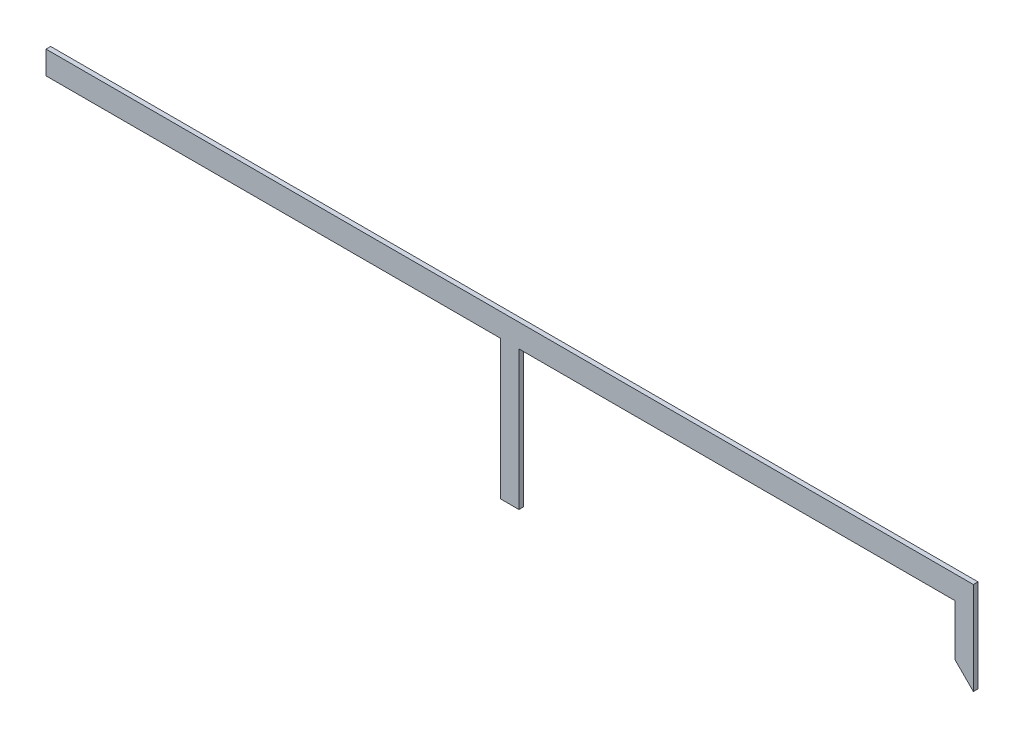
ISO-10303-21;
HEADER;
FILE_DESCRIPTION(('STEP AP214'),'2;1');
FILE_NAME('part.step','',(''),(''),'','','');
FILE_SCHEMA(('AUTOMOTIVE_DESIGN { 1 0 10303 214 1 1 1 1 }'));
ENDSEC;
DATA;
#1=APPLICATION_CONTEXT('core data for automotive mechanical design processes');
#2=APPLICATION_PROTOCOL_DEFINITION('international standard','automotive_design',2000,#1);
#3=PRODUCT_CONTEXT('',#1,'mechanical');
#4=PRODUCT('Part','Part','',(#3));
#5=PRODUCT_RELATED_PRODUCT_CATEGORY('part','',(#4));
#6=PRODUCT_DEFINITION_FORMATION('','',#4);
#7=PRODUCT_DEFINITION_CONTEXT('part definition',#1,'design');
#8=PRODUCT_DEFINITION('design','',#6,#7);
#9=PRODUCT_DEFINITION_SHAPE('','',#8);
#10=(LENGTH_UNIT() NAMED_UNIT(*) SI_UNIT(.MILLI.,.METRE.));
#11=(NAMED_UNIT(*) PLANE_ANGLE_UNIT() SI_UNIT($,.RADIAN.));
#12=(NAMED_UNIT(*) SI_UNIT($,.STERADIAN.) SOLID_ANGLE_UNIT());
#13=UNCERTAINTY_MEASURE_WITH_UNIT(LENGTH_MEASURE(1.E-05),#10,'distance_accuracy_value','');
#14=(GEOMETRIC_REPRESENTATION_CONTEXT(3) GLOBAL_UNCERTAINTY_ASSIGNED_CONTEXT((#13)) GLOBAL_UNIT_ASSIGNED_CONTEXT((#10,
#11,#12)) REPRESENTATION_CONTEXT('',''));
#15=CARTESIAN_POINT('',(0.,0.,0.));
#16=DIRECTION('',(0.,0.,1.));
#17=DIRECTION('',(1.,0.,0.));
#18=AXIS2_PLACEMENT_3D('',#15,#16,#17);
#19=CARTESIAN_POINT('',(500.,1.22464679914735E-13,5.));
#20=DIRECTION('',(-1.,0.,0.));
#21=DIRECTION('',(0.,0.,1.));
#22=AXIS2_PLACEMENT_3D('',#19,#20,#21);
#23=PLANE('',#22);
#24=DIRECTION('',(0.,1.,0.));
#25=VECTOR('',#24,1.);
#26=CARTESIAN_POINT('',(500.,1.22464679914735E-13,0.));
#27=LINE('',#26,#25);
#28=CARTESIAN_POINT('',(500.,-99.9999999999999,0.));
#29=VERTEX_POINT('',#28);
#30=CARTESIAN_POINT('',(500.,1.22464679914735E-13,0.));
#31=VERTEX_POINT('',#30);
#32=EDGE_CURVE('E142',#29,#31,#27,.T.);
#33=ORIENTED_EDGE('',*,*,#32,.T.);
#34=DIRECTION('',(0.,0.,-1.));
#35=VECTOR('',#34,1.);
#36=CARTESIAN_POINT('',(500.,1.22464679914735E-13,5.));
#37=LINE('',#36,#35);
#38=CARTESIAN_POINT('',(500.,1.22464679914735E-13,5.));
#39=VERTEX_POINT('',#38);
#40=EDGE_CURVE('E11',#39,#31,#37,.T.);
#41=ORIENTED_EDGE('',*,*,#40,.F.);
#42=DIRECTION('',(0.,1.,0.));
#43=VECTOR('',#42,1.);
#44=CARTESIAN_POINT('',(500.,1.22464679914735E-13,5.));
#45=LINE('',#44,#43);
#46=CARTESIAN_POINT('',(500.,-99.9999999999999,5.));
#47=VERTEX_POINT('',#46);
#48=EDGE_CURVE('E160',#47,#39,#45,.T.);
#49=ORIENTED_EDGE('',*,*,#48,.F.);
#50=DIRECTION('',(0.,0.,-1.));
#51=VECTOR('',#50,1.);
#52=CARTESIAN_POINT('',(500.,-99.9999999999999,5.));
#53=LINE('',#52,#51);
#54=EDGE_CURVE('E138',#47,#29,#53,.T.);
#55=ORIENTED_EDGE('',*,*,#54,.T.);
#56=EDGE_LOOP('',(#33,#41,#49,#55));
#57=FACE_BOUND('',#56,.T.);
#58=ADVANCED_FACE('F34',(#57),#23,.F.);
#59=CARTESIAN_POINT('',(-500.,0.,5.));
#60=DIRECTION('',(0.,-1.,0.));
#61=DIRECTION('',(1.,0.,0.));
#62=AXIS2_PLACEMENT_3D('',#59,#60,#61);
#63=PLANE('',#62);
#64=DIRECTION('',(-1.,0.,0.));
#65=VECTOR('',#64,1.);
#66=CARTESIAN_POINT('',(-500.,0.,0.));
#67=LINE('',#66,#65);
#68=CARTESIAN_POINT('',(-500.,0.,0.));
#69=VERTEX_POINT('',#68);
#70=EDGE_CURVE('E145',#31,#69,#67,.T.);
#71=ORIENTED_EDGE('',*,*,#70,.T.);
#72=DIRECTION('',(0.,0.,-1.));
#73=VECTOR('',#72,1.);
#74=CARTESIAN_POINT('',(-500.,0.,5.));
#75=LINE('',#74,#73);
#76=CARTESIAN_POINT('',(-500.,0.,5.));
#77=VERTEX_POINT('',#76);
#78=EDGE_CURVE('E42',#77,#69,#75,.T.);
#79=ORIENTED_EDGE('',*,*,#78,.F.);
#80=DIRECTION('',(-1.,0.,0.));
#81=VECTOR('',#80,1.);
#82=CARTESIAN_POINT('',(-500.,0.,5.));
#83=LINE('',#82,#81);
#84=EDGE_CURVE('E99',#39,#77,#83,.T.);
#85=ORIENTED_EDGE('',*,*,#84,.F.);
#86=ORIENTED_EDGE('',*,*,#40,.T.);
#87=EDGE_LOOP('',(#71,#79,#85,#86));
#88=FACE_BOUND('',#87,.T.);
#89=ADVANCED_FACE('F209',(#88),#63,.F.);
#90=CARTESIAN_POINT('',(-500.,0.,5.));
#91=DIRECTION('',(1.,0.,0.));
#92=DIRECTION('',(0.,0.,-1.));
#93=AXIS2_PLACEMENT_3D('',#90,#91,#92);
#94=PLANE('',#93);
#95=DIRECTION('',(0.,-1.,0.));
#96=VECTOR('',#95,1.);
#97=CARTESIAN_POINT('',(-500.,0.,0.));
#98=LINE('',#97,#96);
#99=CARTESIAN_POINT('',(-500.,-25.,0.));
#100=VERTEX_POINT('',#99);
#101=EDGE_CURVE('E147',#69,#100,#98,.T.);
#102=ORIENTED_EDGE('',*,*,#101,.T.);
#103=DIRECTION('',(0.,0.,-1.));
#104=VECTOR('',#103,1.);
#105=CARTESIAN_POINT('',(-500.,-25.,5.));
#106=LINE('',#105,#104);
#107=CARTESIAN_POINT('',(-500.,-25.,5.));
#108=VERTEX_POINT('',#107);
#109=EDGE_CURVE('E173',#108,#100,#106,.T.);
#110=ORIENTED_EDGE('',*,*,#109,.F.);
#111=DIRECTION('',(0.,-1.,0.));
#112=VECTOR('',#111,1.);
#113=CARTESIAN_POINT('',(-500.,0.,5.));
#114=LINE('',#113,#112);
#115=EDGE_CURVE('E181',#77,#108,#114,.T.);
#116=ORIENTED_EDGE('',*,*,#115,.F.);
#117=ORIENTED_EDGE('',*,*,#78,.T.);
#118=EDGE_LOOP('',(#102,#110,#116,#117));
#119=FACE_BOUND('',#118,.T.);
#120=ADVANCED_FACE('F179',(#119),#94,.F.);
#121=CARTESIAN_POINT('',(-500.,-25.,5.));
#122=DIRECTION('',(0.,1.,0.));
#123=DIRECTION('',(0.,0.,1.));
#124=AXIS2_PLACEMENT_3D('',#121,#122,#123);
#125=PLANE('',#124);
#126=DIRECTION('',(1.,0.,0.));
#127=VECTOR('',#126,1.);
#128=CARTESIAN_POINT('',(-500.,-25.,0.));
#129=LINE('',#128,#127);
#130=CARTESIAN_POINT('',(-9.99999999999999,-25.,0.));
#131=VERTEX_POINT('',#130);
#132=EDGE_CURVE('E149',#100,#131,#129,.T.);
#133=ORIENTED_EDGE('',*,*,#132,.T.);
#134=DIRECTION('',(0.,0.,-1.));
#135=VECTOR('',#134,1.);
#136=CARTESIAN_POINT('',(-9.99999999999999,-25.,5.));
#137=LINE('',#136,#135);
#138=CARTESIAN_POINT('',(-9.99999999999999,-25.,5.));
#139=VERTEX_POINT('',#138);
#140=EDGE_CURVE('E170',#139,#131,#137,.T.);
#141=ORIENTED_EDGE('',*,*,#140,.F.);
#142=DIRECTION('',(1.,0.,0.));
#143=VECTOR('',#142,1.);
#144=CARTESIAN_POINT('',(-500.,-25.,5.));
#145=LINE('',#144,#143);
#146=EDGE_CURVE('E199',#108,#139,#145,.T.);
#147=ORIENTED_EDGE('',*,*,#146,.F.);
#148=ORIENTED_EDGE('',*,*,#109,.T.);
#149=EDGE_LOOP('',(#133,#141,#147,#148));
#150=FACE_BOUND('',#149,.T.);
#151=ADVANCED_FACE('F190',(#150),#125,.F.);
#152=CARTESIAN_POINT('',(-9.99999999999999,-25.,5.));
#153=DIRECTION('',(1.,0.,0.));
#154=DIRECTION('',(0.,1.,0.));
#155=AXIS2_PLACEMENT_3D('',#152,#153,#154);
#156=PLANE('',#155);
#157=DIRECTION('',(0.,-1.,0.));
#158=VECTOR('',#157,1.);
#159=CARTESIAN_POINT('',(-9.99999999999999,-25.,0.));
#160=LINE('',#159,#158);
#161=CARTESIAN_POINT('',(-9.99999999999998,-175.,0.));
#162=VERTEX_POINT('',#161);
#163=EDGE_CURVE('E151',#131,#162,#160,.T.);
#164=ORIENTED_EDGE('',*,*,#163,.T.);
#165=DIRECTION('',(0.,0.,-1.));
#166=VECTOR('',#165,1.);
#167=CARTESIAN_POINT('',(-9.99999999999998,-175.,5.));
#168=LINE('',#167,#166);
#169=CARTESIAN_POINT('',(-9.99999999999998,-175.,5.));
#170=VERTEX_POINT('',#169);
#171=EDGE_CURVE('E167',#170,#162,#168,.T.);
#172=ORIENTED_EDGE('',*,*,#171,.F.);
#173=DIRECTION('',(0.,-1.,0.));
#174=VECTOR('',#173,1.);
#175=CARTESIAN_POINT('',(-9.99999999999999,-25.,5.));
#176=LINE('',#175,#174);
#177=EDGE_CURVE('E196',#139,#170,#176,.T.);
#178=ORIENTED_EDGE('',*,*,#177,.F.);
#179=ORIENTED_EDGE('',*,*,#140,.T.);
#180=EDGE_LOOP('',(#164,#172,#178,#179));
#181=FACE_BOUND('',#180,.T.);
#182=ADVANCED_FACE('F194',(#181),#156,.F.);
#183=CARTESIAN_POINT('',(10.,-175.,5.));
#184=DIRECTION('',(0.,1.,0.));
#185=DIRECTION('',(0.,0.,1.));
#186=AXIS2_PLACEMENT_3D('',#183,#184,#185);
#187=PLANE('',#186);
#188=DIRECTION('',(1.,0.,0.));
#189=VECTOR('',#188,1.);
#190=CARTESIAN_POINT('',(10.,-175.,0.));
#191=LINE('',#190,#189);
#192=CARTESIAN_POINT('',(10.,-175.,0.));
#193=VERTEX_POINT('',#192);
#194=EDGE_CURVE('E153',#162,#193,#191,.T.);
#195=ORIENTED_EDGE('',*,*,#194,.T.);
#196=DIRECTION('',(0.,0.,-1.));
#197=VECTOR('',#196,1.);
#198=CARTESIAN_POINT('',(10.,-175.,5.));
#199=LINE('',#198,#197);
#200=CARTESIAN_POINT('',(10.,-175.,5.));
#201=VERTEX_POINT('',#200);
#202=EDGE_CURVE('E164',#201,#193,#199,.T.);
#203=ORIENTED_EDGE('',*,*,#202,.F.);
#204=DIRECTION('',(1.,0.,0.));
#205=VECTOR('',#204,1.);
#206=CARTESIAN_POINT('',(10.,-175.,5.));
#207=LINE('',#206,#205);
#208=EDGE_CURVE('E198',#170,#201,#207,.T.);
#209=ORIENTED_EDGE('',*,*,#208,.F.);
#210=ORIENTED_EDGE('',*,*,#171,.T.);
#211=EDGE_LOOP('',(#195,#203,#209,#210));
#212=FACE_BOUND('',#211,.T.);
#213=ADVANCED_FACE('F221',(#212),#187,.F.);
#214=CARTESIAN_POINT('',(10.,-25.,5.));
#215=DIRECTION('',(-1.,0.,0.));
#216=DIRECTION('',(0.,-1.,0.));
#217=AXIS2_PLACEMENT_3D('',#214,#215,#216);
#218=PLANE('',#217);
#219=DIRECTION('',(0.,1.,0.));
#220=VECTOR('',#219,1.);
#221=CARTESIAN_POINT('',(10.,-25.,0.));
#222=LINE('',#221,#220);
#223=CARTESIAN_POINT('',(10.,-25.,0.));
#224=VERTEX_POINT('',#223);
#225=EDGE_CURVE('E155',#193,#224,#222,.T.);
#226=ORIENTED_EDGE('',*,*,#225,.T.);
#227=DIRECTION('',(0.,0.,-1.));
#228=VECTOR('',#227,1.);
#229=CARTESIAN_POINT('',(10.,-25.,5.));
#230=LINE('',#229,#228);
#231=CARTESIAN_POINT('',(10.,-25.,5.));
#232=VERTEX_POINT('',#231);
#233=EDGE_CURVE('E133',#232,#224,#230,.T.);
#234=ORIENTED_EDGE('',*,*,#233,.F.);
#235=DIRECTION('',(0.,1.,0.));
#236=VECTOR('',#235,1.);
#237=CARTESIAN_POINT('',(10.,-25.,5.));
#238=LINE('',#237,#236);
#239=EDGE_CURVE('E124',#201,#232,#238,.T.);
#240=ORIENTED_EDGE('',*,*,#239,.F.);
#241=ORIENTED_EDGE('',*,*,#202,.T.);
#242=EDGE_LOOP('',(#226,#234,#240,#241));
#243=FACE_BOUND('',#242,.T.);
#244=ADVANCED_FACE('F224',(#243),#218,.F.);
#245=CARTESIAN_POINT('',(480.,-24.9999999999999,5.));
#246=DIRECTION('',(0.,1.,0.));
#247=DIRECTION('',(-1.,0.,0.));
#248=AXIS2_PLACEMENT_3D('',#245,#246,#247);
#249=PLANE('',#248);
#250=DIRECTION('',(1.,0.,0.));
#251=VECTOR('',#250,1.);
#252=CARTESIAN_POINT('',(480.,-24.9999999999999,0.));
#253=LINE('',#252,#251);
#254=CARTESIAN_POINT('',(480.,-24.9999999999999,0.));
#255=VERTEX_POINT('',#254);
#256=EDGE_CURVE('E132',#224,#255,#253,.T.);
#257=ORIENTED_EDGE('',*,*,#256,.T.);
#258=DIRECTION('',(0.,0.,-1.));
#259=VECTOR('',#258,1.);
#260=CARTESIAN_POINT('',(480.,-24.9999999999999,5.));
#261=LINE('',#260,#259);
#262=CARTESIAN_POINT('',(480.,-24.9999999999999,5.));
#263=VERTEX_POINT('',#262);
#264=EDGE_CURVE('E129',#263,#255,#261,.T.);
#265=ORIENTED_EDGE('',*,*,#264,.F.);
#266=DIRECTION('',(1.,0.,0.));
#267=VECTOR('',#266,1.);
#268=CARTESIAN_POINT('',(480.,-24.9999999999999,5.));
#269=LINE('',#268,#267);
#270=EDGE_CURVE('E118',#232,#263,#269,.T.);
#271=ORIENTED_EDGE('',*,*,#270,.F.);
#272=ORIENTED_EDGE('',*,*,#233,.T.);
#273=EDGE_LOOP('',(#257,#265,#271,#272));
#274=FACE_BOUND('',#273,.T.);
#275=ADVANCED_FACE('F130',(#274),#249,.F.);
#276=CARTESIAN_POINT('',(480.,-79.9999999999997,5.));
#277=DIRECTION('',(1.,0.,0.));
#278=DIRECTION('',(0.,0.,-1.));
#279=AXIS2_PLACEMENT_3D('',#276,#277,#278);
#280=PLANE('',#279);
#281=DIRECTION('',(0.,-1.,0.));
#282=VECTOR('',#281,1.);
#283=CARTESIAN_POINT('',(480.,-79.9999999999997,0.));
#284=LINE('',#283,#282);
#285=CARTESIAN_POINT('',(480.,-79.9999999999997,0.));
#286=VERTEX_POINT('',#285);
#287=EDGE_CURVE('E85',#255,#286,#284,.T.);
#288=ORIENTED_EDGE('',*,*,#287,.T.);
#289=DIRECTION('',(0.,0.,-1.));
#290=VECTOR('',#289,1.);
#291=CARTESIAN_POINT('',(480.,-79.9999999999997,5.));
#292=LINE('',#291,#290);
#293=CARTESIAN_POINT('',(480.,-79.9999999999997,5.));
#294=VERTEX_POINT('',#293);
#295=EDGE_CURVE('E134',#294,#286,#292,.T.);
#296=ORIENTED_EDGE('',*,*,#295,.F.);
#297=DIRECTION('',(0.,-1.,0.));
#298=VECTOR('',#297,1.);
#299=CARTESIAN_POINT('',(480.,-79.9999999999997,5.));
#300=LINE('',#299,#298);
#301=EDGE_CURVE('E122',#263,#294,#300,.T.);
#302=ORIENTED_EDGE('',*,*,#301,.F.);
#303=ORIENTED_EDGE('',*,*,#264,.T.);
#304=EDGE_LOOP('',(#288,#296,#302,#303));
#305=FACE_BOUND('',#304,.T.);
#306=ADVANCED_FACE('F136',(#305),#280,.F.);
#307=CARTESIAN_POINT('',(500.,-99.9999999999999,5.));
#308=DIRECTION('',(0.707106781186551,0.707106781186544,0.));
#309=DIRECTION('',(-0.707106781186544,0.707106781186551,0.));
#310=AXIS2_PLACEMENT_3D('',#307,#308,#309);
#311=PLANE('',#310);
#312=DIRECTION('',(0.707106781186544,-0.707106781186551,0.));
#313=VECTOR('',#312,1.);
#314=CARTESIAN_POINT('',(500.,-99.9999999999999,0.));
#315=LINE('',#314,#313);
#316=EDGE_CURVE('E91',#286,#29,#315,.T.);
#317=ORIENTED_EDGE('',*,*,#316,.T.);
#318=ORIENTED_EDGE('',*,*,#54,.F.);
#319=DIRECTION('',(0.707106781186544,-0.707106781186551,0.));
#320=VECTOR('',#319,1.);
#321=CARTESIAN_POINT('',(500.,-99.9999999999999,5.));
#322=LINE('',#321,#320);
#323=EDGE_CURVE('E50',#294,#47,#322,.T.);
#324=ORIENTED_EDGE('',*,*,#323,.F.);
#325=ORIENTED_EDGE('',*,*,#295,.T.);
#326=EDGE_LOOP('',(#317,#318,#324,#325));
#327=FACE_BOUND('',#326,.T.);
#328=ADVANCED_FACE('F233',(#327),#311,.F.);
#329=CARTESIAN_POINT('',(0.,0.,5.));
#330=DIRECTION('',(0.,0.,-1.));
#331=DIRECTION('',(-1.,0.,0.));
#332=AXIS2_PLACEMENT_3D('',#329,#330,#331);
#333=PLANE('',#332);
#334=ORIENTED_EDGE('',*,*,#48,.T.);
#335=ORIENTED_EDGE('',*,*,#84,.T.);
#336=ORIENTED_EDGE('',*,*,#115,.T.);
#337=ORIENTED_EDGE('',*,*,#146,.T.);
#338=ORIENTED_EDGE('',*,*,#177,.T.);
#339=ORIENTED_EDGE('',*,*,#208,.T.);
#340=ORIENTED_EDGE('',*,*,#239,.T.);
#341=ORIENTED_EDGE('',*,*,#270,.T.);
#342=ORIENTED_EDGE('',*,*,#301,.T.);
#343=ORIENTED_EDGE('',*,*,#323,.T.);
#344=EDGE_LOOP('',(#334,#335,#336,#337,#338,#339,#340,#341,#342,#343));
#345=FACE_BOUND('',#344,.T.);
#346=ADVANCED_FACE('F120',(#345),#333,.F.);
#347=CARTESIAN_POINT('',(0.,0.,0.));
#348=DIRECTION('',(0.,0.,-1.));
#349=DIRECTION('',(-1.,0.,0.));
#350=AXIS2_PLACEMENT_3D('',#347,#348,#349);
#351=PLANE('',#350);
#352=ORIENTED_EDGE('',*,*,#32,.F.);
#353=ORIENTED_EDGE('',*,*,#316,.F.);
#354=ORIENTED_EDGE('',*,*,#287,.F.);
#355=ORIENTED_EDGE('',*,*,#256,.F.);
#356=ORIENTED_EDGE('',*,*,#225,.F.);
#357=ORIENTED_EDGE('',*,*,#194,.F.);
#358=ORIENTED_EDGE('',*,*,#163,.F.);
#359=ORIENTED_EDGE('',*,*,#132,.F.);
#360=ORIENTED_EDGE('',*,*,#101,.F.);
#361=ORIENTED_EDGE('',*,*,#70,.F.);
#362=EDGE_LOOP('',(#352,#353,#354,#355,#356,#357,#358,#359,#360,#361));
#363=FACE_BOUND('',#362,.T.);
#364=ADVANCED_FACE('F185',(#363),#351,.T.);
#365=CLOSED_SHELL('',(#58,#89,#120,#151,#182,#213,#244,#275,#306,#328,#346,#364));
#366=MANIFOLD_SOLID_BREP('B2',#365);
#367=ADVANCED_BREP_SHAPE_REPRESENTATION('',(#18,#366),#14);
#368=SHAPE_DEFINITION_REPRESENTATION(#9,#367);
ENDSEC;
END-ISO-10303-21;
